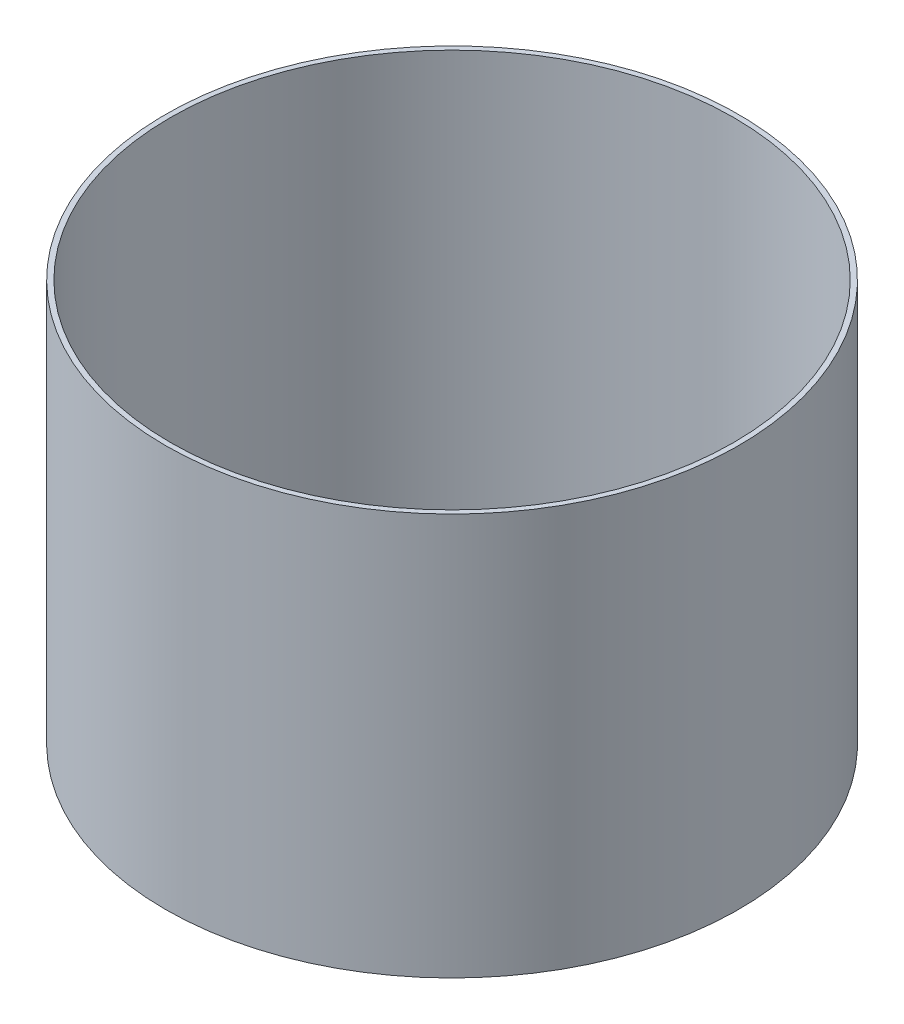
ISO-10303-21;
HEADER;
FILE_DESCRIPTION(('STEP AP214'),'2;1');
FILE_NAME('part.step','',(''),(''),'','','');
FILE_SCHEMA(('AUTOMOTIVE_DESIGN { 1 0 10303 214 1 1 1 1 }'));
ENDSEC;
DATA;
#1=APPLICATION_CONTEXT('core data for automotive mechanical design processes');
#2=APPLICATION_PROTOCOL_DEFINITION('international standard','automotive_design',2000,#1);
#3=PRODUCT_CONTEXT('',#1,'mechanical');
#4=PRODUCT('Part','Part','',(#3));
#5=PRODUCT_RELATED_PRODUCT_CATEGORY('part','',(#4));
#6=PRODUCT_DEFINITION_FORMATION('','',#4);
#7=PRODUCT_DEFINITION_CONTEXT('part definition',#1,'design');
#8=PRODUCT_DEFINITION('design','',#6,#7);
#9=PRODUCT_DEFINITION_SHAPE('','',#8);
#10=(LENGTH_UNIT() NAMED_UNIT(*) SI_UNIT(.MILLI.,.METRE.));
#11=(NAMED_UNIT(*) PLANE_ANGLE_UNIT() SI_UNIT($,.RADIAN.));
#12=(NAMED_UNIT(*) SI_UNIT($,.STERADIAN.) SOLID_ANGLE_UNIT());
#13=UNCERTAINTY_MEASURE_WITH_UNIT(LENGTH_MEASURE(1.E-05),#10,'distance_accuracy_value','');
#14=(GEOMETRIC_REPRESENTATION_CONTEXT(3) GLOBAL_UNCERTAINTY_ASSIGNED_CONTEXT((#13)) GLOBAL_UNIT_ASSIGNED_CONTEXT((#10,
#11,#12)) REPRESENTATION_CONTEXT('',''));
#15=CARTESIAN_POINT('',(0.,0.,0.));
#16=DIRECTION('',(0.,0.,1.));
#17=DIRECTION('',(1.,0.,0.));
#18=AXIS2_PLACEMENT_3D('',#15,#16,#17);
#19=CARTESIAN_POINT('',(0.,-99.6696,0.));
#20=DIRECTION('',(0.,1.,0.));
#21=DIRECTION('',(0.,0.,1.));
#22=AXIS2_PLACEMENT_3D('',#19,#20,#21);
#23=CYLINDRICAL_SURFACE('',#22,71.12);
#24=CARTESIAN_POINT('',(0.,-99.6696,0.));
#25=DIRECTION('',(0.,1.,0.));
#26=DIRECTION('',(0.,0.,1.));
#27=AXIS2_PLACEMENT_3D('',#24,#25,#26);
#28=CIRCLE('',#27,71.12);
#29=CARTESIAN_POINT('',(0.,-99.6696,71.12));
#30=VERTEX_POINT('',#29);
#31=EDGE_CURVE('E10',#30,#30,#28,.T.);
#32=ORIENTED_EDGE('',*,*,#31,.T.);
#33=EDGE_LOOP('',(#32));
#34=FACE_BOUND('',#33,.T.);
#35=CARTESIAN_POINT('',(0.,0.,0.));
#36=DIRECTION('',(0.,1.,0.));
#37=DIRECTION('',(0.,0.,1.));
#38=AXIS2_PLACEMENT_3D('',#35,#36,#37);
#39=CIRCLE('',#38,71.12);
#40=CARTESIAN_POINT('',(0.,0.,71.12));
#41=VERTEX_POINT('',#40);
#42=EDGE_CURVE('E32',#41,#41,#39,.T.);
#43=ORIENTED_EDGE('',*,*,#42,.F.);
#44=EDGE_LOOP('',(#43));
#45=FACE_BOUND('',#44,.T.);
#46=ADVANCED_FACE('F29',(#34,#45),#23,.T.);
#47=CARTESIAN_POINT('',(0.,-99.6696,0.));
#48=DIRECTION('',(0.,1.,0.));
#49=DIRECTION('',(0.,0.,1.));
#50=AXIS2_PLACEMENT_3D('',#47,#48,#49);
#51=PLANE('',#50);
#52=CARTESIAN_POINT('',(0.,-99.6696,0.));
#53=DIRECTION('',(0.,1.,0.));
#54=DIRECTION('',(0.,0.,1.));
#55=AXIS2_PLACEMENT_3D('',#52,#53,#54);
#56=CIRCLE('',#55,69.85);
#57=CARTESIAN_POINT('',(0.,-99.6696,69.85));
#58=VERTEX_POINT('',#57);
#59=EDGE_CURVE('E39',#58,#58,#56,.T.);
#60=ORIENTED_EDGE('',*,*,#59,.T.);
#61=EDGE_LOOP('',(#60));
#62=FACE_BOUND('',#61,.T.);
#63=ORIENTED_EDGE('',*,*,#31,.F.);
#64=EDGE_LOOP('',(#63));
#65=FACE_BOUND('',#64,.T.);
#66=ADVANCED_FACE('F47',(#62,#65),#51,.F.);
#67=CARTESIAN_POINT('',(0.,0.,0.));
#68=DIRECTION('',(0.,1.,0.));
#69=DIRECTION('',(0.,0.,1.));
#70=AXIS2_PLACEMENT_3D('',#67,#68,#69);
#71=PLANE('',#70);
#72=CARTESIAN_POINT('',(0.,0.,0.));
#73=DIRECTION('',(0.,1.,0.));
#74=DIRECTION('',(0.,0.,1.));
#75=AXIS2_PLACEMENT_3D('',#72,#73,#74);
#76=CIRCLE('',#75,69.85);
#77=CARTESIAN_POINT('',(0.,0.,69.85));
#78=VERTEX_POINT('',#77);
#79=EDGE_CURVE('E41',#78,#78,#76,.T.);
#80=ORIENTED_EDGE('',*,*,#79,.F.);
#81=EDGE_LOOP('',(#80));
#82=FACE_BOUND('',#81,.T.);
#83=ORIENTED_EDGE('',*,*,#42,.T.);
#84=EDGE_LOOP('',(#83));
#85=FACE_BOUND('',#84,.T.);
#86=ADVANCED_FACE('F53',(#82,#85),#71,.T.);
#87=CARTESIAN_POINT('',(0.,-99.6696,0.));
#88=DIRECTION('',(0.,1.,0.));
#89=DIRECTION('',(0.,0.,1.));
#90=AXIS2_PLACEMENT_3D('',#87,#88,#89);
#91=CYLINDRICAL_SURFACE('',#90,69.85);
#92=ORIENTED_EDGE('',*,*,#59,.F.);
#93=EDGE_LOOP('',(#92));
#94=FACE_BOUND('',#93,.T.);
#95=ORIENTED_EDGE('',*,*,#79,.T.);
#96=EDGE_LOOP('',(#95));
#97=FACE_BOUND('',#96,.T.);
#98=ADVANCED_FACE('F50',(#94,#97),#91,.F.);
#99=CLOSED_SHELL('',(#46,#66,#86,#98));
#100=MANIFOLD_SOLID_BREP('B2',#99);
#101=ADVANCED_BREP_SHAPE_REPRESENTATION('',(#18,#100),#14);
#102=SHAPE_DEFINITION_REPRESENTATION(#9,#101);
ENDSEC;
END-ISO-10303-21;
